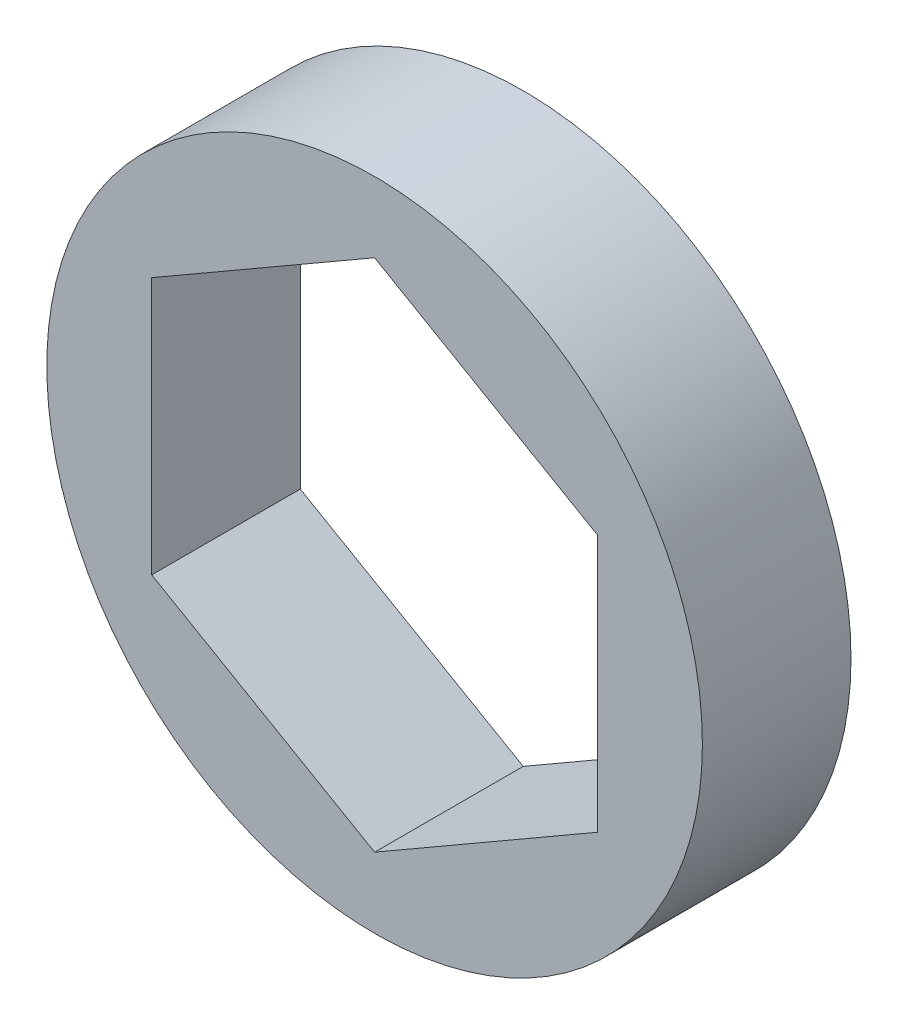
ISO-10303-21;
HEADER;
FILE_DESCRIPTION(('STEP AP214'),'2;1');
FILE_NAME('part.step','',(''),(''),'','','');
FILE_SCHEMA(('AUTOMOTIVE_DESIGN { 1 0 10303 214 1 1 1 1 }'));
ENDSEC;
DATA;
#1=APPLICATION_CONTEXT('core data for automotive mechanical design processes');
#2=APPLICATION_PROTOCOL_DEFINITION('international standard','automotive_design',2000,#1);
#3=PRODUCT_CONTEXT('',#1,'mechanical');
#4=PRODUCT('Part','Part','',(#3));
#5=PRODUCT_RELATED_PRODUCT_CATEGORY('part','',(#4));
#6=PRODUCT_DEFINITION_FORMATION('','',#4);
#7=PRODUCT_DEFINITION_CONTEXT('part definition',#1,'design');
#8=PRODUCT_DEFINITION('design','',#6,#7);
#9=PRODUCT_DEFINITION_SHAPE('','',#8);
#10=(LENGTH_UNIT() NAMED_UNIT(*) SI_UNIT(.MILLI.,.METRE.));
#11=(NAMED_UNIT(*) PLANE_ANGLE_UNIT() SI_UNIT($,.RADIAN.));
#12=(NAMED_UNIT(*) SI_UNIT($,.STERADIAN.) SOLID_ANGLE_UNIT());
#13=UNCERTAINTY_MEASURE_WITH_UNIT(LENGTH_MEASURE(1.E-05),#10,'distance_accuracy_value','');
#14=(GEOMETRIC_REPRESENTATION_CONTEXT(3) GLOBAL_UNCERTAINTY_ASSIGNED_CONTEXT((#13)) GLOBAL_UNIT_ASSIGNED_CONTEXT((#10,
#11,#12)) REPRESENTATION_CONTEXT('',''));
#15=CARTESIAN_POINT('',(0.,0.,0.));
#16=DIRECTION('',(0.,0.,1.));
#17=DIRECTION('',(1.,0.,0.));
#18=AXIS2_PLACEMENT_3D('',#15,#16,#17);
#19=CARTESIAN_POINT('',(0.,0.,4.318));
#20=DIRECTION('',(0.,0.,1.));
#21=DIRECTION('',(1.,0.,0.));
#22=AXIS2_PLACEMENT_3D('',#19,#20,#21);
#23=PLANE('',#22);
#24=CARTESIAN_POINT('',(0.,0.,4.318));
#25=DIRECTION('',(0.,0.,1.));
#26=DIRECTION('',(1.,0.,0.));
#27=AXIS2_PLACEMENT_3D('',#24,#25,#26);
#28=CIRCLE('',#27,9.525);
#29=CARTESIAN_POINT('',(9.525,0.,4.318));
#30=VERTEX_POINT('',#29);
#31=EDGE_CURVE('E11',#30,#30,#28,.T.);
#32=ORIENTED_EDGE('',*,*,#31,.T.);
#33=EDGE_LOOP('',(#32));
#34=FACE_BOUND('',#33,.T.);
#35=DIRECTION('',(-0.866025403784438,-0.500000000000001,0.));
#36=VECTOR('',#35,1.);
#37=CARTESIAN_POINT('',(0.,7.47899538708242,4.318));
#38=LINE('',#37,#36);
#39=CARTESIAN_POINT('',(0.,7.47899538708242,4.318));
#40=VERTEX_POINT('',#39);
#41=CARTESIAN_POINT('',(-6.47700000000001,3.73949769354119,4.318));
#42=VERTEX_POINT('',#41);
#43=EDGE_CURVE('E100',#40,#42,#38,.T.);
#44=ORIENTED_EDGE('',*,*,#43,.F.);
#45=DIRECTION('',(-0.866025403784442,0.499999999999995,0.));
#46=VECTOR('',#45,1.);
#47=CARTESIAN_POINT('',(6.47699999999996,3.73949769354128,4.318));
#48=LINE('',#47,#46);
#49=CARTESIAN_POINT('',(6.47699999999996,3.73949769354128,4.318));
#50=VERTEX_POINT('',#49);
#51=EDGE_CURVE('E92',#50,#40,#48,.T.);
#52=ORIENTED_EDGE('',*,*,#51,.F.);
#53=DIRECTION('',(0.,1.,0.));
#54=VECTOR('',#53,1.);
#55=CARTESIAN_POINT('',(6.47700000000004,-3.73949769354115,4.318));
#56=LINE('',#55,#54);
#57=CARTESIAN_POINT('',(6.47700000000004,-3.73949769354115,4.318));
#58=VERTEX_POINT('',#57);
#59=EDGE_CURVE('E120',#58,#50,#56,.T.);
#60=ORIENTED_EDGE('',*,*,#59,.F.);
#61=DIRECTION('',(0.866025403784434,0.500000000000007,0.));
#62=VECTOR('',#61,1.);
#63=CARTESIAN_POINT('',(0.,-7.47899538708242,4.318));
#64=LINE('',#63,#62);
#65=CARTESIAN_POINT('',(0.,-7.47899538708242,4.318));
#66=VERTEX_POINT('',#65);
#67=EDGE_CURVE('E118',#66,#58,#64,.T.);
#68=ORIENTED_EDGE('',*,*,#67,.F.);
#69=DIRECTION('',(0.866025403784442,-0.499999999999995,0.));
#70=VECTOR('',#69,1.);
#71=CARTESIAN_POINT('',(-6.47699999999999,-3.73949769354124,4.318));
#72=LINE('',#71,#70);
#73=CARTESIAN_POINT('',(-6.47699999999999,-3.73949769354124,4.318));
#74=VERTEX_POINT('',#73);
#75=EDGE_CURVE('E114',#74,#66,#72,.T.);
#76=ORIENTED_EDGE('',*,*,#75,.F.);
#77=DIRECTION('',(0.,-1.,0.));
#78=VECTOR('',#77,1.);
#79=CARTESIAN_POINT('',(-6.47700000000001,3.73949769354119,4.318));
#80=LINE('',#79,#78);
#81=EDGE_CURVE('E112',#42,#74,#80,.T.);
#82=ORIENTED_EDGE('',*,*,#81,.F.);
#83=EDGE_LOOP('',(#44,#52,#60,#68,#76,#82));
#84=FACE_BOUND('',#83,.T.);
#85=ADVANCED_FACE('F39',(#34,#84),#23,.T.);
#86=CARTESIAN_POINT('',(0.,0.,0.));
#87=DIRECTION('',(0.,0.,1.));
#88=DIRECTION('',(1.,0.,0.));
#89=AXIS2_PLACEMENT_3D('',#86,#87,#88);
#90=PLANE('',#89);
#91=CARTESIAN_POINT('',(0.,0.,0.));
#92=DIRECTION('',(0.,0.,1.));
#93=DIRECTION('',(1.,0.,0.));
#94=AXIS2_PLACEMENT_3D('',#91,#92,#93);
#95=CIRCLE('',#94,9.525);
#96=CARTESIAN_POINT('',(9.525,0.,0.));
#97=VERTEX_POINT('',#96);
#98=EDGE_CURVE('E43',#97,#97,#95,.T.);
#99=ORIENTED_EDGE('',*,*,#98,.F.);
#100=EDGE_LOOP('',(#99));
#101=FACE_BOUND('',#100,.T.);
#102=DIRECTION('',(-0.866025403784442,0.499999999999995,0.));
#103=VECTOR('',#102,1.);
#104=CARTESIAN_POINT('',(6.47699999999996,3.73949769354128,0.));
#105=LINE('',#104,#103);
#106=CARTESIAN_POINT('',(6.47699999999996,3.73949769354128,0.));
#107=VERTEX_POINT('',#106);
#108=CARTESIAN_POINT('',(0.,7.47899538708242,0.));
#109=VERTEX_POINT('',#108);
#110=EDGE_CURVE('E62',#107,#109,#105,.T.);
#111=ORIENTED_EDGE('',*,*,#110,.T.);
#112=DIRECTION('',(-0.866025403784438,-0.500000000000001,0.));
#113=VECTOR('',#112,1.);
#114=CARTESIAN_POINT('',(0.,7.47899538708242,0.));
#115=LINE('',#114,#113);
#116=CARTESIAN_POINT('',(-6.47700000000001,3.73949769354119,0.));
#117=VERTEX_POINT('',#116);
#118=EDGE_CURVE('E107',#109,#117,#115,.T.);
#119=ORIENTED_EDGE('',*,*,#118,.T.);
#120=DIRECTION('',(0.,-1.,0.));
#121=VECTOR('',#120,1.);
#122=CARTESIAN_POINT('',(-6.47700000000001,3.73949769354119,0.));
#123=LINE('',#122,#121);
#124=CARTESIAN_POINT('',(-6.47699999999999,-3.73949769354124,0.));
#125=VERTEX_POINT('',#124);
#126=EDGE_CURVE('E124',#117,#125,#123,.T.);
#127=ORIENTED_EDGE('',*,*,#126,.T.);
#128=DIRECTION('',(0.866025403784442,-0.499999999999995,0.));
#129=VECTOR('',#128,1.);
#130=CARTESIAN_POINT('',(-6.47699999999999,-3.73949769354124,0.));
#131=LINE('',#130,#129);
#132=CARTESIAN_POINT('',(0.,-7.47899538708242,0.));
#133=VERTEX_POINT('',#132);
#134=EDGE_CURVE('E127',#125,#133,#131,.T.);
#135=ORIENTED_EDGE('',*,*,#134,.T.);
#136=DIRECTION('',(0.866025403784434,0.500000000000007,0.));
#137=VECTOR('',#136,1.);
#138=CARTESIAN_POINT('',(0.,-7.47899538708242,0.));
#139=LINE('',#138,#137);
#140=CARTESIAN_POINT('',(6.47700000000004,-3.73949769354115,0.));
#141=VERTEX_POINT('',#140);
#142=EDGE_CURVE('E130',#133,#141,#139,.T.);
#143=ORIENTED_EDGE('',*,*,#142,.T.);
#144=DIRECTION('',(0.,1.,0.));
#145=VECTOR('',#144,1.);
#146=CARTESIAN_POINT('',(6.47700000000004,-3.73949769354115,0.));
#147=LINE('',#146,#145);
#148=EDGE_CURVE('E101',#141,#107,#147,.T.);
#149=ORIENTED_EDGE('',*,*,#148,.T.);
#150=EDGE_LOOP('',(#111,#119,#127,#135,#143,#149));
#151=FACE_BOUND('',#150,.T.);
#152=ADVANCED_FACE('F147',(#101,#151),#90,.F.);
#153=CARTESIAN_POINT('',(0.,0.,4.318));
#154=DIRECTION('',(0.,0.,-1.));
#155=DIRECTION('',(-1.,0.,0.));
#156=AXIS2_PLACEMENT_3D('',#153,#154,#155);
#157=CYLINDRICAL_SURFACE('',#156,9.525);
#158=ORIENTED_EDGE('',*,*,#31,.F.);
#159=EDGE_LOOP('',(#158));
#160=FACE_BOUND('',#159,.T.);
#161=ORIENTED_EDGE('',*,*,#98,.T.);
#162=EDGE_LOOP('',(#161));
#163=FACE_BOUND('',#162,.T.);
#164=ADVANCED_FACE('F41',(#160,#163),#157,.T.);
#165=CARTESIAN_POINT('',(6.47699999999996,3.73949769354128,4.318));
#166=DIRECTION('',(-0.499999999999995,-0.866025403784441,0.));
#167=DIRECTION('',(0.866025403784441,-0.499999999999995,0.));
#168=AXIS2_PLACEMENT_3D('',#165,#166,#167);
#169=PLANE('',#168);
#170=ORIENTED_EDGE('',*,*,#110,.F.);
#171=DIRECTION('',(0.,0.,-1.));
#172=VECTOR('',#171,1.);
#173=CARTESIAN_POINT('',(6.47699999999996,3.73949769354128,4.318));
#174=LINE('',#173,#172);
#175=EDGE_CURVE('E96',#50,#107,#174,.T.);
#176=ORIENTED_EDGE('',*,*,#175,.F.);
#177=ORIENTED_EDGE('',*,*,#51,.T.);
#178=DIRECTION('',(0.,0.,-1.));
#179=VECTOR('',#178,1.);
#180=CARTESIAN_POINT('',(0.,7.47899538708242,4.318));
#181=LINE('',#180,#179);
#182=EDGE_CURVE('E95',#40,#109,#181,.T.);
#183=ORIENTED_EDGE('',*,*,#182,.T.);
#184=EDGE_LOOP('',(#170,#176,#177,#183));
#185=FACE_BOUND('',#184,.T.);
#186=ADVANCED_FACE('F94',(#185),#169,.T.);
#187=CARTESIAN_POINT('',(0.,7.47899538708242,4.318));
#188=DIRECTION('',(0.500000000000001,-0.866025403784438,0.));
#189=DIRECTION('',(0.866025403784438,0.500000000000001,0.));
#190=AXIS2_PLACEMENT_3D('',#187,#188,#189);
#191=PLANE('',#190);
#192=ORIENTED_EDGE('',*,*,#118,.F.);
#193=ORIENTED_EDGE('',*,*,#182,.F.);
#194=ORIENTED_EDGE('',*,*,#43,.T.);
#195=DIRECTION('',(0.,0.,-1.));
#196=VECTOR('',#195,1.);
#197=CARTESIAN_POINT('',(-6.47700000000001,3.73949769354119,4.318));
#198=LINE('',#197,#196);
#199=EDGE_CURVE('E108',#42,#117,#198,.T.);
#200=ORIENTED_EDGE('',*,*,#199,.T.);
#201=EDGE_LOOP('',(#192,#193,#194,#200));
#202=FACE_BOUND('',#201,.T.);
#203=ADVANCED_FACE('F104',(#202),#191,.T.);
#204=CARTESIAN_POINT('',(-6.47700000000001,3.73949769354119,4.318));
#205=DIRECTION('',(1.,0.,0.));
#206=DIRECTION('',(0.,1.,0.));
#207=AXIS2_PLACEMENT_3D('',#204,#205,#206);
#208=PLANE('',#207);
#209=ORIENTED_EDGE('',*,*,#126,.F.);
#210=ORIENTED_EDGE('',*,*,#199,.F.);
#211=ORIENTED_EDGE('',*,*,#81,.T.);
#212=DIRECTION('',(0.,0.,-1.));
#213=VECTOR('',#212,1.);
#214=CARTESIAN_POINT('',(-6.47699999999999,-3.73949769354124,4.318));
#215=LINE('',#214,#213);
#216=EDGE_CURVE('E139',#74,#125,#215,.T.);
#217=ORIENTED_EDGE('',*,*,#216,.T.);
#218=EDGE_LOOP('',(#209,#210,#211,#217));
#219=FACE_BOUND('',#218,.T.);
#220=ADVANCED_FACE('F143',(#219),#208,.T.);
#221=CARTESIAN_POINT('',(-6.47699999999999,-3.73949769354124,4.318));
#222=DIRECTION('',(0.499999999999995,0.866025403784442,0.));
#223=DIRECTION('',(-0.866025403784442,0.499999999999995,0.));
#224=AXIS2_PLACEMENT_3D('',#221,#222,#223);
#225=PLANE('',#224);
#226=ORIENTED_EDGE('',*,*,#134,.F.);
#227=ORIENTED_EDGE('',*,*,#216,.F.);
#228=ORIENTED_EDGE('',*,*,#75,.T.);
#229=DIRECTION('',(0.,0.,-1.));
#230=VECTOR('',#229,1.);
#231=CARTESIAN_POINT('',(0.,-7.47899538708242,4.318));
#232=LINE('',#231,#230);
#233=EDGE_CURVE('E137',#66,#133,#232,.T.);
#234=ORIENTED_EDGE('',*,*,#233,.T.);
#235=EDGE_LOOP('',(#226,#227,#228,#234));
#236=FACE_BOUND('',#235,.T.);
#237=ADVANCED_FACE('F155',(#236),#225,.T.);
#238=CARTESIAN_POINT('',(0.,-7.47899538708242,4.318));
#239=DIRECTION('',(-0.500000000000007,0.866025403784434,0.));
#240=DIRECTION('',(-0.866025403784435,-0.500000000000007,0.));
#241=AXIS2_PLACEMENT_3D('',#238,#239,#240);
#242=PLANE('',#241);
#243=ORIENTED_EDGE('',*,*,#142,.F.);
#244=ORIENTED_EDGE('',*,*,#233,.F.);
#245=ORIENTED_EDGE('',*,*,#67,.T.);
#246=DIRECTION('',(0.,0.,-1.));
#247=VECTOR('',#246,1.);
#248=CARTESIAN_POINT('',(6.47700000000004,-3.73949769354115,4.318));
#249=LINE('',#248,#247);
#250=EDGE_CURVE('E54',#58,#141,#249,.T.);
#251=ORIENTED_EDGE('',*,*,#250,.T.);
#252=EDGE_LOOP('',(#243,#244,#245,#251));
#253=FACE_BOUND('',#252,.T.);
#254=ADVANCED_FACE('F153',(#253),#242,.T.);
#255=CARTESIAN_POINT('',(6.47700000000004,-3.73949769354115,4.318));
#256=DIRECTION('',(-1.,0.,0.));
#257=DIRECTION('',(0.,-1.,0.));
#258=AXIS2_PLACEMENT_3D('',#255,#256,#257);
#259=PLANE('',#258);
#260=ORIENTED_EDGE('',*,*,#148,.F.);
#261=ORIENTED_EDGE('',*,*,#250,.F.);
#262=ORIENTED_EDGE('',*,*,#59,.T.);
#263=ORIENTED_EDGE('',*,*,#175,.T.);
#264=EDGE_LOOP('',(#260,#261,#262,#263));
#265=FACE_BOUND('',#264,.T.);
#266=ADVANCED_FACE('F149',(#265),#259,.T.);
#267=CLOSED_SHELL('',(#85,#152,#164,#186,#203,#220,#237,#254,#266));
#268=MANIFOLD_SOLID_BREP('B2',#267);
#269=ADVANCED_BREP_SHAPE_REPRESENTATION('',(#18,#268),#14);
#270=SHAPE_DEFINITION_REPRESENTATION(#9,#269);
ENDSEC;
END-ISO-10303-21;
